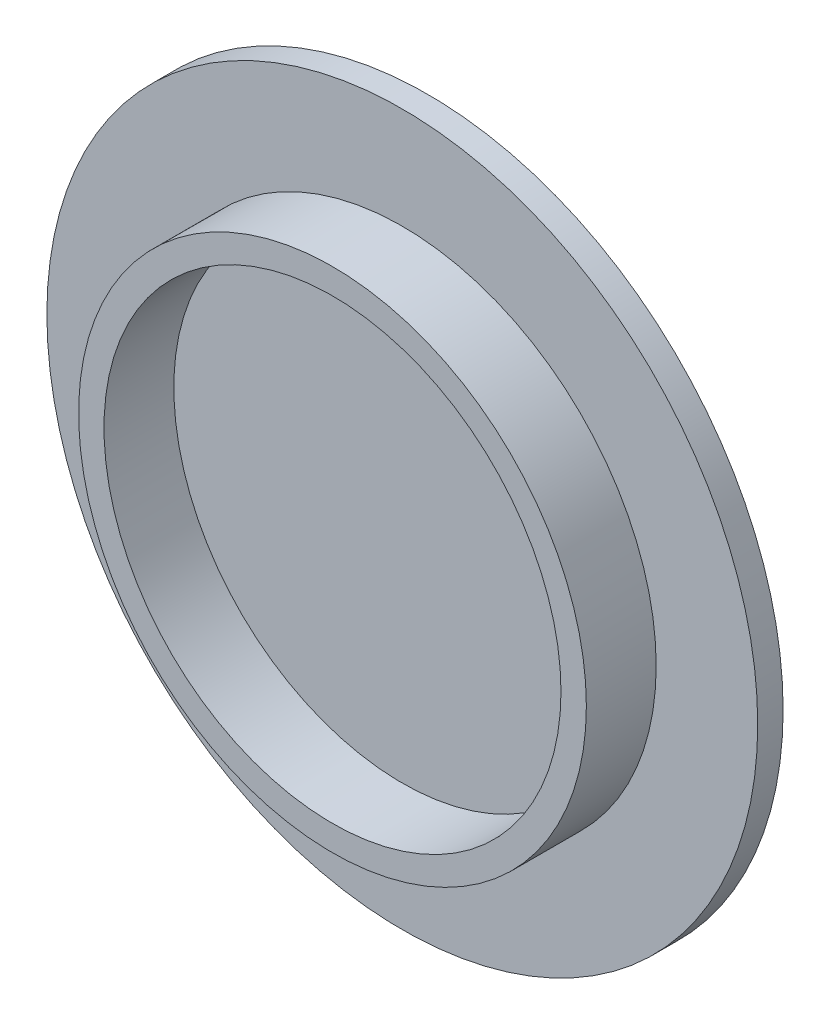
ISO-10303-21;
HEADER;
FILE_DESCRIPTION(('STEP AP214'),'2;1');
FILE_NAME('part.step','',(''),(''),'','','');
FILE_SCHEMA(('AUTOMOTIVE_DESIGN { 1 0 10303 214 1 1 1 1 }'));
ENDSEC;
DATA;
#1=APPLICATION_CONTEXT('core data for automotive mechanical design processes');
#2=APPLICATION_PROTOCOL_DEFINITION('international standard','automotive_design',2000,#1);
#3=PRODUCT_CONTEXT('',#1,'mechanical');
#4=PRODUCT('Part','Part','',(#3));
#5=PRODUCT_RELATED_PRODUCT_CATEGORY('part','',(#4));
#6=PRODUCT_DEFINITION_FORMATION('','',#4);
#7=PRODUCT_DEFINITION_CONTEXT('part definition',#1,'design');
#8=PRODUCT_DEFINITION('design','',#6,#7);
#9=PRODUCT_DEFINITION_SHAPE('','',#8);
#10=(LENGTH_UNIT() NAMED_UNIT(*) SI_UNIT(.MILLI.,.METRE.));
#11=(NAMED_UNIT(*) PLANE_ANGLE_UNIT() SI_UNIT($,.RADIAN.));
#12=(NAMED_UNIT(*) SI_UNIT($,.STERADIAN.) SOLID_ANGLE_UNIT());
#13=UNCERTAINTY_MEASURE_WITH_UNIT(LENGTH_MEASURE(1.E-05),#10,'distance_accuracy_value','');
#14=(GEOMETRIC_REPRESENTATION_CONTEXT(3) GLOBAL_UNCERTAINTY_ASSIGNED_CONTEXT((#13)) GLOBAL_UNIT_ASSIGNED_CONTEXT((#10,
#11,#12)) REPRESENTATION_CONTEXT('',''));
#15=CARTESIAN_POINT('',(0.,0.,0.));
#16=DIRECTION('',(0.,0.,1.));
#17=DIRECTION('',(1.,0.,0.));
#18=AXIS2_PLACEMENT_3D('',#15,#16,#17);
#19=CARTESIAN_POINT('',(0.,0.,10.));
#20=DIRECTION('',(0.,0.,1.));
#21=DIRECTION('',(1.,0.,0.));
#22=AXIS2_PLACEMENT_3D('',#19,#20,#21);
#23=PLANE('',#22);
#24=CARTESIAN_POINT('',(0.,0.,10.));
#25=DIRECTION('',(0.,0.,1.));
#26=DIRECTION('',(1.,0.,0.));
#27=AXIS2_PLACEMENT_3D('',#24,#25,#26);
#28=CIRCLE('',#27,140.);
#29=CARTESIAN_POINT('',(140.,0.,10.));
#30=VERTEX_POINT('',#29);
#31=EDGE_CURVE('E49',#30,#30,#28,.T.);
#32=ORIENTED_EDGE('',*,*,#31,.T.);
#33=EDGE_LOOP('',(#32));
#34=FACE_BOUND('',#33,.T.);
#35=CARTESIAN_POINT('',(0.,0.,10.));
#36=DIRECTION('',(0.,0.,1.));
#37=DIRECTION('',(1.,0.,0.));
#38=AXIS2_PLACEMENT_3D('',#35,#36,#37);
#39=CIRCLE('',#38,100.);
#40=CARTESIAN_POINT('',(100.,0.,10.));
#41=VERTEX_POINT('',#40);
#42=EDGE_CURVE('E62',#41,#41,#39,.T.);
#43=ORIENTED_EDGE('',*,*,#42,.F.);
#44=EDGE_LOOP('',(#43));
#45=FACE_BOUND('',#44,.T.);
#46=ADVANCED_FACE('F41',(#34,#45),#23,.T.);
#47=CARTESIAN_POINT('',(0.,0.,10.));
#48=DIRECTION('',(0.,0.,-1.));
#49=DIRECTION('',(-1.,0.,0.));
#50=AXIS2_PLACEMENT_3D('',#47,#48,#49);
#51=CYLINDRICAL_SURFACE('',#50,140.);
#52=ORIENTED_EDGE('',*,*,#31,.F.);
#53=EDGE_LOOP('',(#52));
#54=FACE_BOUND('',#53,.T.);
#55=CARTESIAN_POINT('',(0.,0.,0.));
#56=DIRECTION('',(0.,0.,1.));
#57=DIRECTION('',(1.,0.,0.));
#58=AXIS2_PLACEMENT_3D('',#55,#56,#57);
#59=CIRCLE('',#58,140.);
#60=CARTESIAN_POINT('',(140.,0.,0.));
#61=VERTEX_POINT('',#60);
#62=EDGE_CURVE('E54',#61,#61,#59,.T.);
#63=ORIENTED_EDGE('',*,*,#62,.T.);
#64=EDGE_LOOP('',(#63));
#65=FACE_BOUND('',#64,.T.);
#66=ADVANCED_FACE('F43',(#54,#65),#51,.T.);
#67=CARTESIAN_POINT('',(0.,0.,0.));
#68=DIRECTION('',(0.,0.,1.));
#69=DIRECTION('',(1.,0.,0.));
#70=AXIS2_PLACEMENT_3D('',#67,#68,#69);
#71=PLANE('',#70);
#72=ORIENTED_EDGE('',*,*,#62,.F.);
#73=EDGE_LOOP('',(#72));
#74=FACE_BOUND('',#73,.T.);
#75=ADVANCED_FACE('F79',(#74),#71,.F.);
#76=CARTESIAN_POINT('',(0.,0.,37.5));
#77=DIRECTION('',(0.,0.,1.));
#78=DIRECTION('',(1.,0.,0.));
#79=AXIS2_PLACEMENT_3D('',#76,#77,#78);
#80=PLANE('',#79);
#81=CARTESIAN_POINT('',(0.,0.,37.5));
#82=DIRECTION('',(0.,0.,1.));
#83=DIRECTION('',(1.,0.,0.));
#84=AXIS2_PLACEMENT_3D('',#81,#82,#83);
#85=CIRCLE('',#84,100.);
#86=CARTESIAN_POINT('',(100.,0.,37.5));
#87=VERTEX_POINT('',#86);
#88=EDGE_CURVE('E60',#87,#87,#85,.T.);
#89=ORIENTED_EDGE('',*,*,#88,.T.);
#90=EDGE_LOOP('',(#89));
#91=FACE_BOUND('',#90,.T.);
#92=CARTESIAN_POINT('',(0.,0.,37.5));
#93=DIRECTION('',(0.,0.,1.));
#94=DIRECTION('',(1.,0.,0.));
#95=AXIS2_PLACEMENT_3D('',#92,#93,#94);
#96=CIRCLE('',#95,90.);
#97=CARTESIAN_POINT('',(90.,0.,37.5));
#98=VERTEX_POINT('',#97);
#99=EDGE_CURVE('E66',#98,#98,#96,.T.);
#100=ORIENTED_EDGE('',*,*,#99,.F.);
#101=EDGE_LOOP('',(#100));
#102=FACE_BOUND('',#101,.T.);
#103=ADVANCED_FACE('F76',(#91,#102),#80,.T.);
#104=CARTESIAN_POINT('',(0.,0.,37.5));
#105=DIRECTION('',(0.,0.,-1.));
#106=DIRECTION('',(-1.,0.,0.));
#107=AXIS2_PLACEMENT_3D('',#104,#105,#106);
#108=CYLINDRICAL_SURFACE('',#107,100.);
#109=ORIENTED_EDGE('',*,*,#88,.F.);
#110=EDGE_LOOP('',(#109));
#111=FACE_BOUND('',#110,.T.);
#112=ORIENTED_EDGE('',*,*,#42,.T.);
#113=EDGE_LOOP('',(#112));
#114=FACE_BOUND('',#113,.T.);
#115=ADVANCED_FACE('F78',(#111,#114),#108,.T.);
#116=CARTESIAN_POINT('',(0.,0.,37.5));
#117=DIRECTION('',(0.,0.,-1.));
#118=DIRECTION('',(-1.,0.,0.));
#119=AXIS2_PLACEMENT_3D('',#116,#117,#118);
#120=CYLINDRICAL_SURFACE('',#119,90.);
#121=ORIENTED_EDGE('',*,*,#99,.T.);
#122=EDGE_LOOP('',(#121));
#123=FACE_BOUND('',#122,.T.);
#124=CARTESIAN_POINT('',(0.,0.,10.));
#125=DIRECTION('',(0.,0.,1.));
#126=DIRECTION('',(1.,0.,0.));
#127=AXIS2_PLACEMENT_3D('',#124,#125,#126);
#128=CIRCLE('',#127,90.);
#129=CARTESIAN_POINT('',(90.,0.,10.));
#130=VERTEX_POINT('',#129);
#131=EDGE_CURVE('E10',#130,#130,#128,.F.);
#132=ORIENTED_EDGE('',*,*,#131,.T.);
#133=EDGE_LOOP('',(#132));
#134=FACE_BOUND('',#133,.T.);
#135=ADVANCED_FACE('F74',(#123,#134),#120,.F.);
#136=ORIENTED_EDGE('',*,*,#131,.F.);
#137=EDGE_LOOP('',(#136));
#138=FACE_BOUND('',#137,.T.);
#139=ADVANCED_FACE('F92',(#138),#23,.T.);
#140=CLOSED_SHELL('',(#46,#66,#75,#103,#115,#135,#139));
#141=MANIFOLD_SOLID_BREP('B2',#140);
#142=ADVANCED_BREP_SHAPE_REPRESENTATION('',(#18,#141),#14);
#143=SHAPE_DEFINITION_REPRESENTATION(#9,#142);
ENDSEC;
END-ISO-10303-21;
